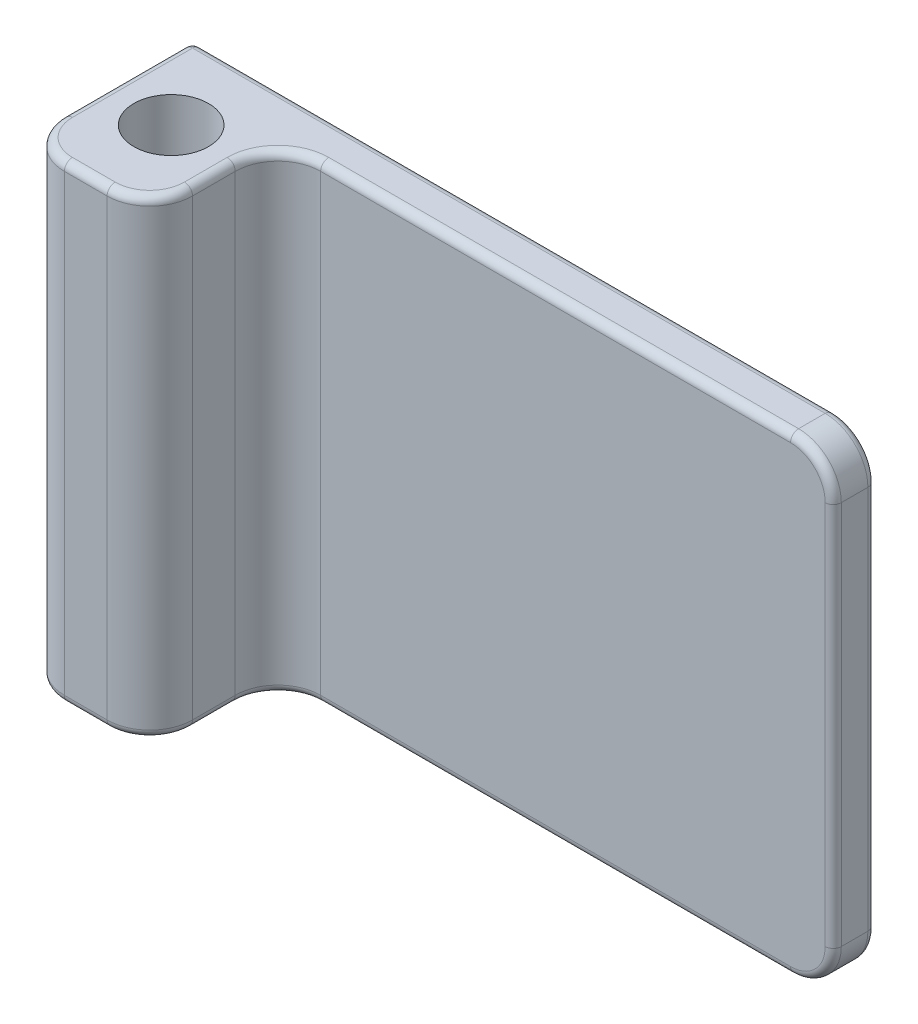
ISO-10303-21;
HEADER;
FILE_DESCRIPTION(('STEP AP214'),'2;1');
FILE_NAME('part.step','',(''),(''),'','','');
FILE_SCHEMA(('AUTOMOTIVE_DESIGN { 1 0 10303 214 1 1 1 1 }'));
ENDSEC;
DATA;
#1=APPLICATION_CONTEXT('core data for automotive mechanical design processes');
#2=APPLICATION_PROTOCOL_DEFINITION('international standard','automotive_design',2000,#1);
#3=PRODUCT_CONTEXT('',#1,'mechanical');
#4=PRODUCT('Part','Part','',(#3));
#5=PRODUCT_RELATED_PRODUCT_CATEGORY('part','',(#4));
#6=PRODUCT_DEFINITION_FORMATION('','',#4);
#7=PRODUCT_DEFINITION_CONTEXT('part definition',#1,'design');
#8=PRODUCT_DEFINITION('design','',#6,#7);
#9=PRODUCT_DEFINITION_SHAPE('','',#8);
#10=(LENGTH_UNIT() NAMED_UNIT(*) SI_UNIT(.MILLI.,.METRE.));
#11=(NAMED_UNIT(*) PLANE_ANGLE_UNIT() SI_UNIT($,.RADIAN.));
#12=(NAMED_UNIT(*) SI_UNIT($,.STERADIAN.) SOLID_ANGLE_UNIT());
#13=UNCERTAINTY_MEASURE_WITH_UNIT(LENGTH_MEASURE(1.E-05),#10,'distance_accuracy_value','');
#14=(GEOMETRIC_REPRESENTATION_CONTEXT(3) GLOBAL_UNCERTAINTY_ASSIGNED_CONTEXT((#13)) GLOBAL_UNIT_ASSIGNED_CONTEXT((#10,
#11,#12)) REPRESENTATION_CONTEXT('',''));
#15=CARTESIAN_POINT('',(0.,0.,0.));
#16=DIRECTION('',(0.,0.,1.));
#17=DIRECTION('',(1.,0.,0.));
#18=AXIS2_PLACEMENT_3D('',#15,#16,#17);
#19=CARTESIAN_POINT('',(101.6,69.85,50.8));
#20=DIRECTION('',(-1.,0.,0.));
#21=DIRECTION('',(0.,0.,1.));
#22=AXIS2_PLACEMENT_3D('',#19,#20,#21);
#23=PLANE('',#22);
#24=DIRECTION('',(0.,0.,-1.));
#25=VECTOR('',#24,1.);
#26=CARTESIAN_POINT('',(101.6,-57.15,50.8));
#27=LINE('',#26,#25);
#28=CARTESIAN_POINT('',(101.6,-57.15,10.3));
#29=VERTEX_POINT('',#28);
#30=CARTESIAN_POINT('',(101.6,-57.15,2.4));
#31=VERTEX_POINT('',#30);
#32=EDGE_CURVE('E215',#29,#31,#27,.T.);
#33=ORIENTED_EDGE('',*,*,#32,.T.);
#34=DIRECTION('',(0.,1.,0.));
#35=VECTOR('',#34,1.);
#36=CARTESIAN_POINT('',(101.6,69.85,2.4));
#37=LINE('',#36,#35);
#38=CARTESIAN_POINT('',(101.6,57.15,2.4));
#39=VERTEX_POINT('',#38);
#40=EDGE_CURVE('E307',#31,#39,#37,.T.);
#41=ORIENTED_EDGE('',*,*,#40,.T.);
#42=DIRECTION('',(0.,0.,-1.));
#43=VECTOR('',#42,1.);
#44=CARTESIAN_POINT('',(101.6,57.15,50.8));
#45=LINE('',#44,#43);
#46=CARTESIAN_POINT('',(101.6,57.15,10.3));
#47=VERTEX_POINT('',#46);
#48=EDGE_CURVE('E275',#39,#47,#45,.F.);
#49=ORIENTED_EDGE('',*,*,#48,.T.);
#50=DIRECTION('',(0.,-1.,0.));
#51=VECTOR('',#50,1.);
#52=CARTESIAN_POINT('',(101.6,69.85,10.3));
#53=LINE('',#52,#51);
#54=EDGE_CURVE('E305',#47,#29,#53,.T.);
#55=ORIENTED_EDGE('',*,*,#54,.T.);
#56=EDGE_LOOP('',(#33,#41,#49,#55));
#57=FACE_BOUND('',#56,.T.);
#58=ADVANCED_FACE('F39',(#57),#23,.F.);
#59=CARTESIAN_POINT('',(-101.6,69.85,50.8));
#60=DIRECTION('',(0.,-1.,0.));
#61=DIRECTION('',(0.,0.,-1.));
#62=AXIS2_PLACEMENT_3D('',#59,#60,#61);
#63=PLANE('',#62);
#64=CARTESIAN_POINT('',(-82.55,69.85,25.4));
#65=DIRECTION('',(0.,-1.,0.));
#66=DIRECTION('',(0.,0.,-1.));
#67=AXIS2_PLACEMENT_3D('',#64,#65,#66);
#68=CIRCLE('',#67,11.1125);
#69=CARTESIAN_POINT('',(-82.55,69.85,14.2875));
#70=VERTEX_POINT('',#69);
#71=EDGE_CURVE('E249',#70,#70,#68,.T.);
#72=ORIENTED_EDGE('',*,*,#71,.T.);
#73=EDGE_LOOP('',(#72));
#74=FACE_BOUND('',#73,.T.);
#75=DIRECTION('',(0.,0.,-1.));
#76=VECTOR('',#75,1.);
#77=CARTESIAN_POINT('',(88.9,69.85,50.8));
#78=LINE('',#77,#76);
#79=CARTESIAN_POINT('',(88.9,69.85,10.3));
#80=VERTEX_POINT('',#79);
#81=CARTESIAN_POINT('',(88.9,69.85,2.4));
#82=VERTEX_POINT('',#81);
#83=EDGE_CURVE('E197',#80,#82,#78,.T.);
#84=ORIENTED_EDGE('',*,*,#83,.T.);
#85=DIRECTION('',(-1.,0.,0.));
#86=VECTOR('',#85,1.);
#87=CARTESIAN_POINT('',(-101.6,69.85,2.4));
#88=LINE('',#87,#86);
#89=CARTESIAN_POINT('',(-99.2,69.85,2.4));
#90=VERTEX_POINT('',#89);
#91=EDGE_CURVE('E290',#82,#90,#88,.T.);
#92=ORIENTED_EDGE('',*,*,#91,.T.);
#93=DIRECTION('',(0.,0.,-1.));
#94=VECTOR('',#93,1.);
#95=CARTESIAN_POINT('',(-99.2,69.85,50.8));
#96=LINE('',#95,#94);
#97=CARTESIAN_POINT('',(-99.2,69.85,38.1));
#98=VERTEX_POINT('',#97);
#99=EDGE_CURVE('E288',#90,#98,#96,.F.);
#100=ORIENTED_EDGE('',*,*,#99,.T.);
#101=CARTESIAN_POINT('',(-88.9,69.85,38.1));
#102=DIRECTION('',(0.,-1.,0.));
#103=DIRECTION('',(0.,0.,-1.));
#104=AXIS2_PLACEMENT_3D('',#101,#102,#103);
#105=CIRCLE('',#104,10.3);
#106=CARTESIAN_POINT('',(-88.9,69.85,48.4));
#107=VERTEX_POINT('',#106);
#108=EDGE_CURVE('E286',#98,#107,#105,.F.);
#109=ORIENTED_EDGE('',*,*,#108,.T.);
#110=DIRECTION('',(-1.,0.,0.));
#111=VECTOR('',#110,1.);
#112=CARTESIAN_POINT('',(-76.2,69.85,48.4));
#113=LINE('',#112,#111);
#114=CARTESIAN_POINT('',(-76.2,69.85,48.4));
#115=VERTEX_POINT('',#114);
#116=EDGE_CURVE('E284',#107,#115,#113,.F.);
#117=ORIENTED_EDGE('',*,*,#116,.T.);
#118=CARTESIAN_POINT('',(-76.2,69.85,38.1));
#119=DIRECTION('',(0.,-1.,0.));
#120=DIRECTION('',(0.,0.,-1.));
#121=AXIS2_PLACEMENT_3D('',#118,#119,#120);
#122=CIRCLE('',#121,10.3);
#123=CARTESIAN_POINT('',(-65.9,69.85,38.1));
#124=VERTEX_POINT('',#123);
#125=EDGE_CURVE('E282',#115,#124,#122,.F.);
#126=ORIENTED_EDGE('',*,*,#125,.T.);
#127=DIRECTION('',(0.,0.,-1.));
#128=VECTOR('',#127,1.);
#129=CARTESIAN_POINT('',(-65.9,69.85,50.8));
#130=LINE('',#129,#128);
#131=CARTESIAN_POINT('',(-65.9,69.85,25.4));
#132=VERTEX_POINT('',#131);
#133=EDGE_CURVE('E280',#124,#132,#130,.T.);
#134=ORIENTED_EDGE('',*,*,#133,.T.);
#135=CARTESIAN_POINT('',(-50.8,69.85,25.4));
#136=DIRECTION('',(0.,-1.,0.));
#137=DIRECTION('',(0.,0.,-1.));
#138=AXIS2_PLACEMENT_3D('',#135,#136,#137);
#139=CIRCLE('',#138,15.1);
#140=CARTESIAN_POINT('',(-50.8,69.85,10.3));
#141=VERTEX_POINT('',#140);
#142=EDGE_CURVE('E200',#132,#141,#139,.T.);
#143=ORIENTED_EDGE('',*,*,#142,.T.);
#144=DIRECTION('',(1.,0.,0.));
#145=VECTOR('',#144,1.);
#146=CARTESIAN_POINT('',(-101.6,69.85,10.3));
#147=LINE('',#146,#145);
#148=EDGE_CURVE('E193',#141,#80,#147,.T.);
#149=ORIENTED_EDGE('',*,*,#148,.T.);
#150=EDGE_LOOP('',(#84,#92,#100,#109,#117,#126,#134,#143,#149));
#151=FACE_BOUND('',#150,.T.);
#152=ADVANCED_FACE('F195',(#74,#151),#63,.F.);
#153=CARTESIAN_POINT('',(-101.6,69.85,50.8));
#154=DIRECTION('',(1.,0.,0.));
#155=DIRECTION('',(0.,0.,-1.));
#156=AXIS2_PLACEMENT_3D('',#153,#154,#155);
#157=PLANE('',#156);
#158=DIRECTION('',(0.,-1.,0.));
#159=VECTOR('',#158,1.);
#160=CARTESIAN_POINT('',(-101.6,69.85,2.4));
#161=LINE('',#160,#159);
#162=CARTESIAN_POINT('',(-101.6,67.45,2.4));
#163=VERTEX_POINT('',#162);
#164=CARTESIAN_POINT('',(-101.6,-67.45,2.4));
#165=VERTEX_POINT('',#164);
#166=EDGE_CURVE('E329',#163,#165,#161,.T.);
#167=ORIENTED_EDGE('',*,*,#166,.T.);
#168=DIRECTION('',(0.,0.,-1.));
#169=VECTOR('',#168,1.);
#170=CARTESIAN_POINT('',(-101.6,-67.45,50.8));
#171=LINE('',#170,#169);
#172=CARTESIAN_POINT('',(-101.6,-67.45,38.1));
#173=VERTEX_POINT('',#172);
#174=EDGE_CURVE('E333',#165,#173,#171,.F.);
#175=ORIENTED_EDGE('',*,*,#174,.T.);
#176=DIRECTION('',(0.,-1.,0.));
#177=VECTOR('',#176,1.);
#178=CARTESIAN_POINT('',(-101.6,69.85,38.1));
#179=LINE('',#178,#177);
#180=CARTESIAN_POINT('',(-101.6,67.45,38.1));
#181=VERTEX_POINT('',#180);
#182=EDGE_CURVE('E262',#173,#181,#179,.F.);
#183=ORIENTED_EDGE('',*,*,#182,.T.);
#184=DIRECTION('',(0.,0.,-1.));
#185=VECTOR('',#184,1.);
#186=CARTESIAN_POINT('',(-101.6,67.45,50.8));
#187=LINE('',#186,#185);
#188=EDGE_CURVE('E331',#181,#163,#187,.T.);
#189=ORIENTED_EDGE('',*,*,#188,.T.);
#190=EDGE_LOOP('',(#167,#175,#183,#189));
#191=FACE_BOUND('',#190,.T.);
#192=ADVANCED_FACE('F464',(#191),#157,.F.);
#193=CARTESIAN_POINT('',(-101.6,-69.85,50.8));
#194=DIRECTION('',(0.,1.,0.));
#195=DIRECTION('',(0.,0.,1.));
#196=AXIS2_PLACEMENT_3D('',#193,#194,#195);
#197=PLANE('',#196);
#198=CARTESIAN_POINT('',(-82.55,-69.85,25.4));
#199=DIRECTION('',(0.,-1.,0.));
#200=DIRECTION('',(0.,0.,-1.));
#201=AXIS2_PLACEMENT_3D('',#198,#199,#200);
#202=CIRCLE('',#201,11.1125);
#203=CARTESIAN_POINT('',(-82.55,-69.85,14.2875));
#204=VERTEX_POINT('',#203);
#205=EDGE_CURVE('E244',#204,#204,#202,.T.);
#206=ORIENTED_EDGE('',*,*,#205,.F.);
#207=EDGE_LOOP('',(#206));
#208=FACE_BOUND('',#207,.T.);
#209=DIRECTION('',(0.,0.,-1.));
#210=VECTOR('',#209,1.);
#211=CARTESIAN_POINT('',(-99.2,-69.85,50.8));
#212=LINE('',#211,#210);
#213=CARTESIAN_POINT('',(-99.2,-69.85,38.1));
#214=VERTEX_POINT('',#213);
#215=CARTESIAN_POINT('',(-99.2,-69.85,2.4));
#216=VERTEX_POINT('',#215);
#217=EDGE_CURVE('E325',#214,#216,#212,.T.);
#218=ORIENTED_EDGE('',*,*,#217,.T.);
#219=DIRECTION('',(1.,0.,0.));
#220=VECTOR('',#219,1.);
#221=CARTESIAN_POINT('',(-101.6,-69.85,2.4));
#222=LINE('',#221,#220);
#223=CARTESIAN_POINT('',(88.9,-69.85,2.4));
#224=VERTEX_POINT('',#223);
#225=EDGE_CURVE('E327',#216,#224,#222,.T.);
#226=ORIENTED_EDGE('',*,*,#225,.T.);
#227=DIRECTION('',(0.,0.,-1.));
#228=VECTOR('',#227,1.);
#229=CARTESIAN_POINT('',(88.9,-69.85,50.8));
#230=LINE('',#229,#228);
#231=CARTESIAN_POINT('',(88.9,-69.85,10.3));
#232=VERTEX_POINT('',#231);
#233=EDGE_CURVE('E205',#224,#232,#230,.F.);
#234=ORIENTED_EDGE('',*,*,#233,.T.);
#235=DIRECTION('',(1.,0.,0.));
#236=VECTOR('',#235,1.);
#237=CARTESIAN_POINT('',(-101.6,-69.85,10.3));
#238=LINE('',#237,#236);
#239=CARTESIAN_POINT('',(-50.8,-69.85,10.3));
#240=VERTEX_POINT('',#239);
#241=EDGE_CURVE('E313',#232,#240,#238,.F.);
#242=ORIENTED_EDGE('',*,*,#241,.T.);
#243=CARTESIAN_POINT('',(-50.8,-69.85,25.4));
#244=DIRECTION('',(0.,1.,0.));
#245=DIRECTION('',(0.,0.,1.));
#246=AXIS2_PLACEMENT_3D('',#243,#244,#245);
#247=CIRCLE('',#246,15.1);
#248=CARTESIAN_POINT('',(-65.9,-69.85,25.4));
#249=VERTEX_POINT('',#248);
#250=EDGE_CURVE('E315',#240,#249,#247,.T.);
#251=ORIENTED_EDGE('',*,*,#250,.T.);
#252=DIRECTION('',(0.,0.,-1.));
#253=VECTOR('',#252,1.);
#254=CARTESIAN_POINT('',(-65.9,-69.85,50.8));
#255=LINE('',#254,#253);
#256=CARTESIAN_POINT('',(-65.9,-69.85,38.1));
#257=VERTEX_POINT('',#256);
#258=EDGE_CURVE('E317',#249,#257,#255,.F.);
#259=ORIENTED_EDGE('',*,*,#258,.T.);
#260=CARTESIAN_POINT('',(-76.2,-69.85,38.1));
#261=DIRECTION('',(0.,1.,0.));
#262=DIRECTION('',(0.,0.,1.));
#263=AXIS2_PLACEMENT_3D('',#260,#261,#262);
#264=CIRCLE('',#263,10.3);
#265=CARTESIAN_POINT('',(-76.2,-69.85,48.4));
#266=VERTEX_POINT('',#265);
#267=EDGE_CURVE('E319',#257,#266,#264,.F.);
#268=ORIENTED_EDGE('',*,*,#267,.T.);
#269=DIRECTION('',(1.,0.,0.));
#270=VECTOR('',#269,1.);
#271=CARTESIAN_POINT('',(-88.9,-69.85,48.4));
#272=LINE('',#271,#270);
#273=CARTESIAN_POINT('',(-88.9,-69.85,48.4));
#274=VERTEX_POINT('',#273);
#275=EDGE_CURVE('E321',#266,#274,#272,.F.);
#276=ORIENTED_EDGE('',*,*,#275,.T.);
#277=CARTESIAN_POINT('',(-88.9,-69.85,38.1));
#278=DIRECTION('',(0.,1.,0.));
#279=DIRECTION('',(0.,0.,1.));
#280=AXIS2_PLACEMENT_3D('',#277,#278,#279);
#281=CIRCLE('',#280,10.3);
#282=EDGE_CURVE('E323',#274,#214,#281,.F.);
#283=ORIENTED_EDGE('',*,*,#282,.T.);
#284=EDGE_LOOP('',(#218,#226,#234,#242,#251,#259,#268,#276,#283));
#285=FACE_BOUND('',#284,.T.);
#286=ADVANCED_FACE('F441',(#208,#285),#197,.F.);
#287=CARTESIAN_POINT('',(0.,0.,50.8));
#288=DIRECTION('',(0.,0.,1.));
#289=DIRECTION('',(1.,0.,0.));
#290=AXIS2_PLACEMENT_3D('',#287,#288,#289);
#291=PLANE('',#290);
#292=DIRECTION('',(0.,-1.,0.));
#293=VECTOR('',#292,1.);
#294=CARTESIAN_POINT('',(-88.9,-69.85,50.8));
#295=LINE('',#294,#293);
#296=CARTESIAN_POINT('',(-88.9,67.45,50.8));
#297=VERTEX_POINT('',#296);
#298=CARTESIAN_POINT('',(-88.9,-67.45,50.8));
#299=VERTEX_POINT('',#298);
#300=EDGE_CURVE('E259',#297,#299,#295,.T.);
#301=ORIENTED_EDGE('',*,*,#300,.T.);
#302=DIRECTION('',(1.,0.,0.));
#303=VECTOR('',#302,1.);
#304=CARTESIAN_POINT('',(-76.2,-67.45,50.8));
#305=LINE('',#304,#303);
#306=CARTESIAN_POINT('',(-76.2,-67.45,50.8));
#307=VERTEX_POINT('',#306);
#308=EDGE_CURVE('E342',#299,#307,#305,.T.);
#309=ORIENTED_EDGE('',*,*,#308,.T.);
#310=DIRECTION('',(0.,-1.,0.));
#311=VECTOR('',#310,1.);
#312=CARTESIAN_POINT('',(-76.2,69.85,50.8));
#313=LINE('',#312,#311);
#314=CARTESIAN_POINT('',(-76.2,67.45,50.8));
#315=VERTEX_POINT('',#314);
#316=EDGE_CURVE('E254',#307,#315,#313,.F.);
#317=ORIENTED_EDGE('',*,*,#316,.T.);
#318=DIRECTION('',(-1.,0.,0.));
#319=VECTOR('',#318,1.);
#320=CARTESIAN_POINT('',(-88.9,67.45,50.8));
#321=LINE('',#320,#319);
#322=EDGE_CURVE('E340',#315,#297,#321,.T.);
#323=ORIENTED_EDGE('',*,*,#322,.T.);
#324=EDGE_LOOP('',(#301,#309,#317,#323));
#325=FACE_BOUND('',#324,.T.);
#326=ADVANCED_FACE('F761',(#325),#291,.T.);
#327=CARTESIAN_POINT('',(0.,0.,0.));
#328=DIRECTION('',(0.,0.,1.));
#329=DIRECTION('',(1.,0.,0.));
#330=AXIS2_PLACEMENT_3D('',#327,#328,#329);
#331=PLANE('',#330);
#332=DIRECTION('',(0.,-1.,0.));
#333=VECTOR('',#332,1.);
#334=CARTESIAN_POINT('',(-99.2,0.,0.));
#335=LINE('',#334,#333);
#336=CARTESIAN_POINT('',(-99.2,-67.45,0.));
#337=VERTEX_POINT('',#336);
#338=CARTESIAN_POINT('',(-99.2,67.45,0.));
#339=VERTEX_POINT('',#338);
#340=EDGE_CURVE('E294',#337,#339,#335,.F.);
#341=ORIENTED_EDGE('',*,*,#340,.T.);
#342=DIRECTION('',(-1.,0.,0.));
#343=VECTOR('',#342,1.);
#344=CARTESIAN_POINT('',(0.,67.45,0.));
#345=LINE('',#344,#343);
#346=CARTESIAN_POINT('',(88.9,67.45,0.));
#347=VERTEX_POINT('',#346);
#348=EDGE_CURVE('E224',#339,#347,#345,.F.);
#349=ORIENTED_EDGE('',*,*,#348,.T.);
#350=CARTESIAN_POINT('',(88.9,57.15,0.));
#351=DIRECTION('',(0.,0.,1.));
#352=DIRECTION('',(1.,0.,0.));
#353=AXIS2_PLACEMENT_3D('',#350,#351,#352);
#354=CIRCLE('',#353,10.3);
#355=CARTESIAN_POINT('',(99.2,57.15,0.));
#356=VERTEX_POINT('',#355);
#357=EDGE_CURVE('E300',#347,#356,#354,.F.);
#358=ORIENTED_EDGE('',*,*,#357,.T.);
#359=DIRECTION('',(0.,1.,0.));
#360=VECTOR('',#359,1.);
#361=CARTESIAN_POINT('',(99.2,0.,0.));
#362=LINE('',#361,#360);
#363=CARTESIAN_POINT('',(99.2,-57.15,0.));
#364=VERTEX_POINT('',#363);
#365=EDGE_CURVE('E298',#356,#364,#362,.F.);
#366=ORIENTED_EDGE('',*,*,#365,.T.);
#367=CARTESIAN_POINT('',(88.9,-57.15,0.));
#368=DIRECTION('',(0.,0.,1.));
#369=DIRECTION('',(1.,0.,0.));
#370=AXIS2_PLACEMENT_3D('',#367,#368,#369);
#371=CIRCLE('',#370,10.3);
#372=CARTESIAN_POINT('',(88.9,-67.45,0.));
#373=VERTEX_POINT('',#372);
#374=EDGE_CURVE('E296',#364,#373,#371,.F.);
#375=ORIENTED_EDGE('',*,*,#374,.T.);
#376=DIRECTION('',(1.,0.,0.));
#377=VECTOR('',#376,1.);
#378=CARTESIAN_POINT('',(0.,-67.45,0.));
#379=LINE('',#378,#377);
#380=EDGE_CURVE('E292',#373,#337,#379,.F.);
#381=ORIENTED_EDGE('',*,*,#380,.T.);
#382=EDGE_LOOP('',(#341,#349,#358,#366,#375,#381));
#383=FACE_BOUND('',#382,.T.);
#384=ADVANCED_FACE('F753',(#383),#331,.F.);
#385=CARTESIAN_POINT('',(-63.5,69.85,50.8));
#386=DIRECTION('',(-1.,0.,0.));
#387=DIRECTION('',(0.,0.,1.));
#388=AXIS2_PLACEMENT_3D('',#385,#386,#387);
#389=PLANE('',#388);
#390=DIRECTION('',(0.,-1.,0.));
#391=VECTOR('',#390,1.);
#392=CARTESIAN_POINT('',(-63.5,-69.85,38.1));
#393=LINE('',#392,#391);
#394=CARTESIAN_POINT('',(-63.5,67.45,38.1));
#395=VERTEX_POINT('',#394);
#396=CARTESIAN_POINT('',(-63.5,-67.45,38.1));
#397=VERTEX_POINT('',#396);
#398=EDGE_CURVE('E268',#395,#397,#393,.T.);
#399=ORIENTED_EDGE('',*,*,#398,.T.);
#400=DIRECTION('',(0.,0.,-1.));
#401=VECTOR('',#400,1.);
#402=CARTESIAN_POINT('',(-63.5,-67.45,50.8));
#403=LINE('',#402,#401);
#404=CARTESIAN_POINT('',(-63.5,-67.45,25.4));
#405=VERTEX_POINT('',#404);
#406=EDGE_CURVE('E350',#397,#405,#403,.T.);
#407=ORIENTED_EDGE('',*,*,#406,.T.);
#408=DIRECTION('',(0.,-1.,0.));
#409=VECTOR('',#408,1.);
#410=CARTESIAN_POINT('',(-63.5,69.85,25.4));
#411=LINE('',#410,#409);
#412=CARTESIAN_POINT('',(-63.5,67.45,25.4));
#413=VERTEX_POINT('',#412);
#414=EDGE_CURVE('E265',#405,#413,#411,.F.);
#415=ORIENTED_EDGE('',*,*,#414,.T.);
#416=DIRECTION('',(0.,0.,-1.));
#417=VECTOR('',#416,1.);
#418=CARTESIAN_POINT('',(-63.5,67.45,50.8));
#419=LINE('',#418,#417);
#420=EDGE_CURVE('E348',#413,#395,#419,.F.);
#421=ORIENTED_EDGE('',*,*,#420,.T.);
#422=EDGE_LOOP('',(#399,#407,#415,#421));
#423=FACE_BOUND('',#422,.T.);
#424=ADVANCED_FACE('F426',(#423),#389,.F.);
#425=CARTESIAN_POINT('',(-63.5,69.85,12.7));
#426=DIRECTION('',(0.,0.,-1.));
#427=DIRECTION('',(-1.,0.,0.));
#428=AXIS2_PLACEMENT_3D('',#425,#426,#427);
#429=PLANE('',#428);
#430=CARTESIAN_POINT('',(88.9,57.15,12.7));
#431=DIRECTION('',(0.,0.,-1.));
#432=DIRECTION('',(-1.,0.,0.));
#433=AXIS2_PLACEMENT_3D('',#430,#431,#432);
#434=CIRCLE('',#433,10.3);
#435=CARTESIAN_POINT('',(99.2,57.15,12.7));
#436=VERTEX_POINT('',#435);
#437=CARTESIAN_POINT('',(88.9,67.45,12.7));
#438=VERTEX_POINT('',#437);
#439=EDGE_CURVE('E48',#436,#438,#434,.F.);
#440=ORIENTED_EDGE('',*,*,#439,.T.);
#441=DIRECTION('',(1.,0.,0.));
#442=VECTOR('',#441,1.);
#443=CARTESIAN_POINT('',(-63.5,67.45,12.7));
#444=LINE('',#443,#442);
#445=CARTESIAN_POINT('',(-50.8,67.45,12.7));
#446=VERTEX_POINT('',#445);
#447=EDGE_CURVE('E11',#438,#446,#444,.F.);
#448=ORIENTED_EDGE('',*,*,#447,.T.);
#449=DIRECTION('',(0.,-1.,0.));
#450=VECTOR('',#449,1.);
#451=CARTESIAN_POINT('',(-50.8,-69.85,12.7));
#452=LINE('',#451,#450);
#453=CARTESIAN_POINT('',(-50.8,-67.45,12.7));
#454=VERTEX_POINT('',#453);
#455=EDGE_CURVE('E216',#446,#454,#452,.T.);
#456=ORIENTED_EDGE('',*,*,#455,.T.);
#457=DIRECTION('',(1.,0.,0.));
#458=VECTOR('',#457,1.);
#459=CARTESIAN_POINT('',(-63.5,-67.45,12.7));
#460=LINE('',#459,#458);
#461=CARTESIAN_POINT('',(88.9,-67.45,12.7));
#462=VERTEX_POINT('',#461);
#463=EDGE_CURVE('E356',#454,#462,#460,.T.);
#464=ORIENTED_EDGE('',*,*,#463,.T.);
#465=CARTESIAN_POINT('',(88.9,-57.15,12.7));
#466=DIRECTION('',(0.,0.,-1.));
#467=DIRECTION('',(-1.,0.,0.));
#468=AXIS2_PLACEMENT_3D('',#465,#466,#467);
#469=CIRCLE('',#468,10.3);
#470=CARTESIAN_POINT('',(99.2,-57.15,12.7));
#471=VERTEX_POINT('',#470);
#472=EDGE_CURVE('E358',#462,#471,#469,.F.);
#473=ORIENTED_EDGE('',*,*,#472,.T.);
#474=DIRECTION('',(0.,-1.,0.));
#475=VECTOR('',#474,1.);
#476=CARTESIAN_POINT('',(99.2,69.85,12.7));
#477=LINE('',#476,#475);
#478=EDGE_CURVE('E59',#471,#436,#477,.F.);
#479=ORIENTED_EDGE('',*,*,#478,.T.);
#480=EDGE_LOOP('',(#440,#448,#456,#464,#473,#479));
#481=FACE_BOUND('',#480,.T.);
#482=ADVANCED_FACE('F447',(#481),#429,.F.);
#483=CARTESIAN_POINT('',(-82.55,69.85,25.4));
#484=DIRECTION('',(0.,-1.,0.));
#485=DIRECTION('',(0.,0.,-1.));
#486=AXIS2_PLACEMENT_3D('',#483,#484,#485);
#487=CYLINDRICAL_SURFACE('',#486,11.1125);
#488=ORIENTED_EDGE('',*,*,#71,.F.);
#489=EDGE_LOOP('',(#488));
#490=FACE_BOUND('',#489,.T.);
#491=ORIENTED_EDGE('',*,*,#205,.T.);
#492=EDGE_LOOP('',(#491));
#493=FACE_BOUND('',#492,.T.);
#494=ADVANCED_FACE('F473',(#490,#493),#487,.F.);
#495=CARTESIAN_POINT('',(-88.9,0.,38.1));
#496=DIRECTION('',(0.,1.,0.));
#497=DIRECTION('',(0.,0.,1.));
#498=AXIS2_PLACEMENT_3D('',#495,#496,#497);
#499=CYLINDRICAL_SURFACE('',#498,12.7);
#500=ORIENTED_EDGE('',*,*,#182,.F.);
#501=CARTESIAN_POINT('',(-88.9,-67.45,38.1));
#502=DIRECTION('',(0.,1.,0.));
#503=DIRECTION('',(0.,0.,1.));
#504=AXIS2_PLACEMENT_3D('',#501,#502,#503);
#505=CIRCLE('',#504,12.7);
#506=EDGE_CURVE('E338',#173,#299,#505,.T.);
#507=ORIENTED_EDGE('',*,*,#506,.T.);
#508=ORIENTED_EDGE('',*,*,#300,.F.);
#509=CARTESIAN_POINT('',(-88.9,67.45,38.1));
#510=DIRECTION('',(0.,-1.,0.));
#511=DIRECTION('',(0.,0.,-1.));
#512=AXIS2_PLACEMENT_3D('',#509,#510,#511);
#513=CIRCLE('',#512,12.7);
#514=EDGE_CURVE('E336',#297,#181,#513,.T.);
#515=ORIENTED_EDGE('',*,*,#514,.T.);
#516=EDGE_LOOP('',(#500,#507,#508,#515));
#517=FACE_BOUND('',#516,.T.);
#518=ADVANCED_FACE('F469',(#517),#499,.T.);
#519=CARTESIAN_POINT('',(-76.2,69.85,38.1));
#520=DIRECTION('',(0.,1.,0.));
#521=DIRECTION('',(0.,0.,1.));
#522=AXIS2_PLACEMENT_3D('',#519,#520,#521);
#523=CYLINDRICAL_SURFACE('',#522,12.7);
#524=ORIENTED_EDGE('',*,*,#316,.F.);
#525=CARTESIAN_POINT('',(-76.2,-67.45,38.1));
#526=DIRECTION('',(0.,1.,0.));
#527=DIRECTION('',(0.,0.,1.));
#528=AXIS2_PLACEMENT_3D('',#525,#526,#527);
#529=CIRCLE('',#528,12.7);
#530=EDGE_CURVE('E346',#307,#397,#529,.T.);
#531=ORIENTED_EDGE('',*,*,#530,.T.);
#532=ORIENTED_EDGE('',*,*,#398,.F.);
#533=CARTESIAN_POINT('',(-76.2,67.45,38.1));
#534=DIRECTION('',(0.,-1.,0.));
#535=DIRECTION('',(0.,0.,-1.));
#536=AXIS2_PLACEMENT_3D('',#533,#534,#535);
#537=CIRCLE('',#536,12.7);
#538=EDGE_CURVE('E344',#395,#315,#537,.T.);
#539=ORIENTED_EDGE('',*,*,#538,.T.);
#540=EDGE_LOOP('',(#524,#531,#532,#539));
#541=FACE_BOUND('',#540,.T.);
#542=ADVANCED_FACE('F472',(#541),#523,.T.);
#543=CARTESIAN_POINT('',(-50.8,69.85,25.4));
#544=DIRECTION('',(0.,1.,0.));
#545=DIRECTION('',(0.,0.,1.));
#546=AXIS2_PLACEMENT_3D('',#543,#544,#545);
#547=CYLINDRICAL_SURFACE('',#546,12.7);
#548=ORIENTED_EDGE('',*,*,#414,.F.);
#549=CARTESIAN_POINT('',(-50.8,-67.45,25.4));
#550=DIRECTION('',(0.,1.,0.));
#551=DIRECTION('',(0.,0.,1.));
#552=AXIS2_PLACEMENT_3D('',#549,#550,#551);
#553=CIRCLE('',#552,12.7);
#554=EDGE_CURVE('E354',#405,#454,#553,.F.);
#555=ORIENTED_EDGE('',*,*,#554,.T.);
#556=ORIENTED_EDGE('',*,*,#455,.F.);
#557=CARTESIAN_POINT('',(-50.8,67.45,25.4));
#558=DIRECTION('',(0.,-1.,0.));
#559=DIRECTION('',(0.,0.,-1.));
#560=AXIS2_PLACEMENT_3D('',#557,#558,#559);
#561=CIRCLE('',#560,12.7);
#562=EDGE_CURVE('E352',#446,#413,#561,.F.);
#563=ORIENTED_EDGE('',*,*,#562,.T.);
#564=EDGE_LOOP('',(#548,#555,#556,#563));
#565=FACE_BOUND('',#564,.T.);
#566=ADVANCED_FACE('F423',(#565),#547,.F.);
#567=CARTESIAN_POINT('',(88.9,57.15,50.8));
#568=DIRECTION('',(0.,0.,-1.));
#569=DIRECTION('',(-1.,0.,0.));
#570=AXIS2_PLACEMENT_3D('',#567,#568,#569);
#571=CYLINDRICAL_SURFACE('',#570,12.7);
#572=ORIENTED_EDGE('',*,*,#48,.F.);
#573=CARTESIAN_POINT('',(88.9,57.15,2.4));
#574=DIRECTION('',(0.,0.,1.));
#575=DIRECTION('',(1.,0.,0.));
#576=AXIS2_PLACEMENT_3D('',#573,#574,#575);
#577=CIRCLE('',#576,12.7);
#578=EDGE_CURVE('E214',#39,#82,#577,.T.);
#579=ORIENTED_EDGE('',*,*,#578,.T.);
#580=ORIENTED_EDGE('',*,*,#83,.F.);
#581=CARTESIAN_POINT('',(88.9,57.15,10.3));
#582=DIRECTION('',(0.,0.,-1.));
#583=DIRECTION('',(-1.,0.,0.));
#584=AXIS2_PLACEMENT_3D('',#581,#582,#583);
#585=CIRCLE('',#584,12.7);
#586=EDGE_CURVE('E211',#80,#47,#585,.T.);
#587=ORIENTED_EDGE('',*,*,#586,.T.);
#588=EDGE_LOOP('',(#572,#579,#580,#587));
#589=FACE_BOUND('',#588,.T.);
#590=ADVANCED_FACE('F210',(#589),#571,.T.);
#591=CARTESIAN_POINT('',(88.9,-57.15,50.8));
#592=DIRECTION('',(0.,0.,-1.));
#593=DIRECTION('',(-1.,0.,0.));
#594=AXIS2_PLACEMENT_3D('',#591,#592,#593);
#595=CYLINDRICAL_SURFACE('',#594,12.7);
#596=ORIENTED_EDGE('',*,*,#233,.F.);
#597=CARTESIAN_POINT('',(88.9,-57.15,2.4));
#598=DIRECTION('',(0.,0.,1.));
#599=DIRECTION('',(1.,0.,0.));
#600=AXIS2_PLACEMENT_3D('',#597,#598,#599);
#601=CIRCLE('',#600,12.7);
#602=EDGE_CURVE('E311',#224,#31,#601,.T.);
#603=ORIENTED_EDGE('',*,*,#602,.T.);
#604=ORIENTED_EDGE('',*,*,#32,.F.);
#605=CARTESIAN_POINT('',(88.9,-57.15,10.3));
#606=DIRECTION('',(0.,0.,-1.));
#607=DIRECTION('',(-1.,0.,0.));
#608=AXIS2_PLACEMENT_3D('',#605,#606,#607);
#609=CIRCLE('',#608,12.7);
#610=EDGE_CURVE('E309',#29,#232,#609,.T.);
#611=ORIENTED_EDGE('',*,*,#610,.T.);
#612=EDGE_LOOP('',(#596,#603,#604,#611));
#613=FACE_BOUND('',#612,.T.);
#614=ADVANCED_FACE('F482',(#613),#595,.T.);
#615=CARTESIAN_POINT('',(88.9,-57.15,10.3));
#616=DIRECTION('',(0.,0.,-1.));
#617=DIRECTION('',(-1.,0.,0.));
#618=AXIS2_PLACEMENT_3D('',#615,#616,#617);
#619=TOROIDAL_SURFACE('',#618,10.3,2.4);
#620=CARTESIAN_POINT('',(88.9,-67.45,10.3));
#621=DIRECTION('',(-1.,0.,0.));
#622=DIRECTION('',(0.,0.,1.));
#623=AXIS2_PLACEMENT_3D('',#620,#621,#622);
#624=CIRCLE('',#623,2.4);
#625=EDGE_CURVE('E237',#232,#462,#624,.T.);
#626=ORIENTED_EDGE('',*,*,#625,.F.);
#627=ORIENTED_EDGE('',*,*,#610,.F.);
#628=CARTESIAN_POINT('',(99.2,-57.15,10.3));
#629=DIRECTION('',(0.,1.,0.));
#630=DIRECTION('',(0.,0.,1.));
#631=AXIS2_PLACEMENT_3D('',#628,#629,#630);
#632=CIRCLE('',#631,2.4);
#633=EDGE_CURVE('E43',#471,#29,#632,.T.);
#634=ORIENTED_EDGE('',*,*,#633,.F.);
#635=ORIENTED_EDGE('',*,*,#472,.F.);
#636=EDGE_LOOP('',(#626,#627,#634,#635));
#637=FACE_BOUND('',#636,.T.);
#638=ADVANCED_FACE('F41',(#637),#619,.T.);
#639=CARTESIAN_POINT('',(99.2,69.85,10.3));
#640=DIRECTION('',(0.,-1.,0.));
#641=DIRECTION('',(0.,0.,-1.));
#642=AXIS2_PLACEMENT_3D('',#639,#640,#641);
#643=CYLINDRICAL_SURFACE('',#642,2.4);
#644=ORIENTED_EDGE('',*,*,#633,.T.);
#645=ORIENTED_EDGE('',*,*,#54,.F.);
#646=CARTESIAN_POINT('',(99.2,57.15,10.3));
#647=DIRECTION('',(0.,1.,0.));
#648=DIRECTION('',(0.,0.,1.));
#649=AXIS2_PLACEMENT_3D('',#646,#647,#648);
#650=CIRCLE('',#649,2.4);
#651=EDGE_CURVE('E223',#436,#47,#650,.T.);
#652=ORIENTED_EDGE('',*,*,#651,.F.);
#653=ORIENTED_EDGE('',*,*,#478,.F.);
#654=EDGE_LOOP('',(#644,#645,#652,#653));
#655=FACE_BOUND('',#654,.T.);
#656=ADVANCED_FACE('F451',(#655),#643,.T.);
#657=CARTESIAN_POINT('',(-63.5,-67.45,10.3));
#658=DIRECTION('',(1.,0.,0.));
#659=DIRECTION('',(0.,0.,-1.));
#660=AXIS2_PLACEMENT_3D('',#657,#658,#659);
#661=CYLINDRICAL_SURFACE('',#660,2.4);
#662=ORIENTED_EDGE('',*,*,#625,.T.);
#663=ORIENTED_EDGE('',*,*,#463,.F.);
#664=CARTESIAN_POINT('',(-50.8,-67.45,10.3));
#665=DIRECTION('',(-1.,0.,0.));
#666=DIRECTION('',(0.,0.,1.));
#667=AXIS2_PLACEMENT_3D('',#664,#665,#666);
#668=CIRCLE('',#667,2.4);
#669=EDGE_CURVE('E227',#240,#454,#668,.T.);
#670=ORIENTED_EDGE('',*,*,#669,.F.);
#671=ORIENTED_EDGE('',*,*,#241,.F.);
#672=EDGE_LOOP('',(#662,#663,#670,#671));
#673=FACE_BOUND('',#672,.T.);
#674=ADVANCED_FACE('F449',(#673),#661,.T.);
#675=CARTESIAN_POINT('',(88.9,57.15,10.3));
#676=DIRECTION('',(0.,0.,-1.));
#677=DIRECTION('',(-1.,0.,0.));
#678=AXIS2_PLACEMENT_3D('',#675,#676,#677);
#679=TOROIDAL_SURFACE('',#678,10.3,2.4);
#680=ORIENTED_EDGE('',*,*,#651,.T.);
#681=ORIENTED_EDGE('',*,*,#586,.F.);
#682=CARTESIAN_POINT('',(88.9,67.45,10.3));
#683=DIRECTION('',(-1.,0.,0.));
#684=DIRECTION('',(0.,0.,1.));
#685=AXIS2_PLACEMENT_3D('',#682,#683,#684);
#686=CIRCLE('',#685,2.4);
#687=EDGE_CURVE('E221',#438,#80,#686,.T.);
#688=ORIENTED_EDGE('',*,*,#687,.F.);
#689=ORIENTED_EDGE('',*,*,#439,.F.);
#690=EDGE_LOOP('',(#680,#681,#688,#689));
#691=FACE_BOUND('',#690,.T.);
#692=ADVANCED_FACE('F220',(#691),#679,.T.);
#693=CARTESIAN_POINT('',(-50.8,-67.45,25.4));
#694=DIRECTION('',(0.,1.,0.));
#695=DIRECTION('',(0.,0.,1.));
#696=AXIS2_PLACEMENT_3D('',#693,#694,#695);
#697=TOROIDAL_SURFACE('',#696,15.1,2.4);
#698=ORIENTED_EDGE('',*,*,#669,.T.);
#699=ORIENTED_EDGE('',*,*,#554,.F.);
#700=CARTESIAN_POINT('',(-65.9,-67.45,25.4));
#701=DIRECTION('',(0.,0.,1.));
#702=DIRECTION('',(1.,0.,0.));
#703=AXIS2_PLACEMENT_3D('',#700,#701,#702);
#704=CIRCLE('',#703,2.4);
#705=EDGE_CURVE('E228',#249,#405,#704,.T.);
#706=ORIENTED_EDGE('',*,*,#705,.F.);
#707=ORIENTED_EDGE('',*,*,#250,.F.);
#708=EDGE_LOOP('',(#698,#699,#706,#707));
#709=FACE_BOUND('',#708,.T.);
#710=ADVANCED_FACE('F446',(#709),#697,.T.);
#711=CARTESIAN_POINT('',(-101.6,67.45,10.3));
#712=DIRECTION('',(1.,0.,0.));
#713=DIRECTION('',(0.,0.,-1.));
#714=AXIS2_PLACEMENT_3D('',#711,#712,#713);
#715=CYLINDRICAL_SURFACE('',#714,2.4);
#716=ORIENTED_EDGE('',*,*,#687,.T.);
#717=ORIENTED_EDGE('',*,*,#148,.F.);
#718=CARTESIAN_POINT('',(-50.8,67.45,10.3));
#719=DIRECTION('',(-1.,0.,0.));
#720=DIRECTION('',(0.,0.,1.));
#721=AXIS2_PLACEMENT_3D('',#718,#719,#720);
#722=CIRCLE('',#721,2.4);
#723=EDGE_CURVE('E233',#446,#141,#722,.T.);
#724=ORIENTED_EDGE('',*,*,#723,.F.);
#725=ORIENTED_EDGE('',*,*,#447,.F.);
#726=EDGE_LOOP('',(#716,#717,#724,#725));
#727=FACE_BOUND('',#726,.T.);
#728=ADVANCED_FACE('F226',(#727),#715,.T.);
#729=CARTESIAN_POINT('',(-65.9,-67.45,50.8));
#730=DIRECTION('',(0.,0.,-1.));
#731=DIRECTION('',(-1.,0.,0.));
#732=AXIS2_PLACEMENT_3D('',#729,#730,#731);
#733=CYLINDRICAL_SURFACE('',#732,2.4);
#734=ORIENTED_EDGE('',*,*,#705,.T.);
#735=ORIENTED_EDGE('',*,*,#406,.F.);
#736=CARTESIAN_POINT('',(-65.9,-67.45,38.1));
#737=DIRECTION('',(0.,0.,1.));
#738=DIRECTION('',(1.,0.,0.));
#739=AXIS2_PLACEMENT_3D('',#736,#737,#738);
#740=CIRCLE('',#739,2.4);
#741=EDGE_CURVE('E413',#257,#397,#740,.T.);
#742=ORIENTED_EDGE('',*,*,#741,.F.);
#743=ORIENTED_EDGE('',*,*,#258,.F.);
#744=EDGE_LOOP('',(#734,#735,#742,#743));
#745=FACE_BOUND('',#744,.T.);
#746=ADVANCED_FACE('F431',(#745),#733,.T.);
#747=CARTESIAN_POINT('',(-50.8,67.45,25.4));
#748=DIRECTION('',(0.,-1.,0.));
#749=DIRECTION('',(0.,0.,-1.));
#750=AXIS2_PLACEMENT_3D('',#747,#748,#749);
#751=TOROIDAL_SURFACE('',#750,15.1,2.4);
#752=ORIENTED_EDGE('',*,*,#723,.T.);
#753=ORIENTED_EDGE('',*,*,#142,.F.);
#754=CARTESIAN_POINT('',(-65.9,67.45,25.4));
#755=DIRECTION('',(0.,0.,1.));
#756=DIRECTION('',(1.,0.,0.));
#757=AXIS2_PLACEMENT_3D('',#754,#755,#756);
#758=CIRCLE('',#757,2.4);
#759=EDGE_CURVE('E410',#413,#132,#758,.T.);
#760=ORIENTED_EDGE('',*,*,#759,.F.);
#761=ORIENTED_EDGE('',*,*,#562,.F.);
#762=EDGE_LOOP('',(#752,#753,#760,#761));
#763=FACE_BOUND('',#762,.T.);
#764=ADVANCED_FACE('F417',(#763),#751,.T.);
#765=CARTESIAN_POINT('',(-76.2,-67.45,38.1));
#766=DIRECTION('',(0.,1.,0.));
#767=DIRECTION('',(0.,0.,1.));
#768=AXIS2_PLACEMENT_3D('',#765,#766,#767);
#769=TOROIDAL_SURFACE('',#768,10.3,2.4);
#770=ORIENTED_EDGE('',*,*,#741,.T.);
#771=ORIENTED_EDGE('',*,*,#530,.F.);
#772=CARTESIAN_POINT('',(-76.2,-67.45,48.4));
#773=DIRECTION('',(-1.,0.,0.));
#774=DIRECTION('',(0.,0.,1.));
#775=AXIS2_PLACEMENT_3D('',#772,#773,#774);
#776=CIRCLE('',#775,2.4);
#777=EDGE_CURVE('E407',#266,#307,#776,.T.);
#778=ORIENTED_EDGE('',*,*,#777,.F.);
#779=ORIENTED_EDGE('',*,*,#267,.F.);
#780=EDGE_LOOP('',(#770,#771,#778,#779));
#781=FACE_BOUND('',#780,.T.);
#782=ADVANCED_FACE('F437',(#781),#769,.T.);
#783=CARTESIAN_POINT('',(-65.9,67.45,50.8));
#784=DIRECTION('',(0.,0.,-1.));
#785=DIRECTION('',(-1.,0.,0.));
#786=AXIS2_PLACEMENT_3D('',#783,#784,#785);
#787=CYLINDRICAL_SURFACE('',#786,2.4);
#788=ORIENTED_EDGE('',*,*,#759,.T.);
#789=ORIENTED_EDGE('',*,*,#133,.F.);
#790=CARTESIAN_POINT('',(-65.9,67.45,38.1));
#791=DIRECTION('',(0.,0.,1.));
#792=DIRECTION('',(1.,0.,0.));
#793=AXIS2_PLACEMENT_3D('',#790,#791,#792);
#794=CIRCLE('',#793,2.4);
#795=EDGE_CURVE('E404',#395,#124,#794,.T.);
#796=ORIENTED_EDGE('',*,*,#795,.F.);
#797=ORIENTED_EDGE('',*,*,#420,.F.);
#798=EDGE_LOOP('',(#788,#789,#796,#797));
#799=FACE_BOUND('',#798,.T.);
#800=ADVANCED_FACE('F545',(#799),#787,.T.);
#801=CARTESIAN_POINT('',(0.,-67.45,48.4));
#802=DIRECTION('',(-1.,0.,0.));
#803=DIRECTION('',(0.,0.,1.));
#804=AXIS2_PLACEMENT_3D('',#801,#802,#803);
#805=CYLINDRICAL_SURFACE('',#804,2.4);
#806=ORIENTED_EDGE('',*,*,#777,.T.);
#807=ORIENTED_EDGE('',*,*,#308,.F.);
#808=CARTESIAN_POINT('',(-88.9,-67.45,48.4));
#809=DIRECTION('',(-1.,0.,0.));
#810=DIRECTION('',(0.,0.,1.));
#811=AXIS2_PLACEMENT_3D('',#808,#809,#810);
#812=CIRCLE('',#811,2.4);
#813=EDGE_CURVE('E401',#274,#299,#812,.T.);
#814=ORIENTED_EDGE('',*,*,#813,.F.);
#815=ORIENTED_EDGE('',*,*,#275,.F.);
#816=EDGE_LOOP('',(#806,#807,#814,#815));
#817=FACE_BOUND('',#816,.T.);
#818=ADVANCED_FACE('F541',(#817),#805,.T.);
#819=CARTESIAN_POINT('',(-76.2,67.45,38.1));
#820=DIRECTION('',(0.,-1.,0.));
#821=DIRECTION('',(0.,0.,-1.));
#822=AXIS2_PLACEMENT_3D('',#819,#820,#821);
#823=TOROIDAL_SURFACE('',#822,10.3,2.4);
#824=ORIENTED_EDGE('',*,*,#795,.T.);
#825=ORIENTED_EDGE('',*,*,#125,.F.);
#826=CARTESIAN_POINT('',(-76.2,67.45,48.4));
#827=DIRECTION('',(-1.,0.,0.));
#828=DIRECTION('',(0.,0.,1.));
#829=AXIS2_PLACEMENT_3D('',#826,#827,#828);
#830=CIRCLE('',#829,2.4);
#831=EDGE_CURVE('E398',#315,#115,#830,.T.);
#832=ORIENTED_EDGE('',*,*,#831,.F.);
#833=ORIENTED_EDGE('',*,*,#538,.F.);
#834=EDGE_LOOP('',(#824,#825,#832,#833));
#835=FACE_BOUND('',#834,.T.);
#836=ADVANCED_FACE('F537',(#835),#823,.T.);
#837=CARTESIAN_POINT('',(-88.9,-67.45,38.1));
#838=DIRECTION('',(0.,1.,0.));
#839=DIRECTION('',(0.,0.,1.));
#840=AXIS2_PLACEMENT_3D('',#837,#838,#839);
#841=TOROIDAL_SURFACE('',#840,10.3,2.4);
#842=ORIENTED_EDGE('',*,*,#813,.T.);
#843=ORIENTED_EDGE('',*,*,#506,.F.);
#844=CARTESIAN_POINT('',(-99.2,-67.45,38.1));
#845=DIRECTION('',(0.,0.,-1.));
#846=DIRECTION('',(-1.,0.,0.));
#847=AXIS2_PLACEMENT_3D('',#844,#845,#846);
#848=CIRCLE('',#847,2.4);
#849=EDGE_CURVE('E396',#214,#173,#848,.T.);
#850=ORIENTED_EDGE('',*,*,#849,.F.);
#851=ORIENTED_EDGE('',*,*,#282,.F.);
#852=EDGE_LOOP('',(#842,#843,#850,#851));
#853=FACE_BOUND('',#852,.T.);
#854=ADVANCED_FACE('F533',(#853),#841,.T.);
#855=CARTESIAN_POINT('',(0.,67.45,48.4));
#856=DIRECTION('',(1.,0.,0.));
#857=DIRECTION('',(0.,0.,-1.));
#858=AXIS2_PLACEMENT_3D('',#855,#856,#857);
#859=CYLINDRICAL_SURFACE('',#858,2.4);
#860=ORIENTED_EDGE('',*,*,#831,.T.);
#861=ORIENTED_EDGE('',*,*,#116,.F.);
#862=CARTESIAN_POINT('',(-88.9,67.45,48.4));
#863=DIRECTION('',(-1.,0.,0.));
#864=DIRECTION('',(0.,0.,1.));
#865=AXIS2_PLACEMENT_3D('',#862,#863,#864);
#866=CIRCLE('',#865,2.4);
#867=EDGE_CURVE('E390',#297,#107,#866,.T.);
#868=ORIENTED_EDGE('',*,*,#867,.F.);
#869=ORIENTED_EDGE('',*,*,#322,.F.);
#870=EDGE_LOOP('',(#860,#861,#868,#869));
#871=FACE_BOUND('',#870,.T.);
#872=ADVANCED_FACE('F529',(#871),#859,.T.);
#873=CARTESIAN_POINT('',(-99.2,-67.45,50.8));
#874=DIRECTION('',(0.,0.,-1.));
#875=DIRECTION('',(-1.,0.,0.));
#876=AXIS2_PLACEMENT_3D('',#873,#874,#875);
#877=CYLINDRICAL_SURFACE('',#876,2.4);
#878=ORIENTED_EDGE('',*,*,#849,.T.);
#879=ORIENTED_EDGE('',*,*,#174,.F.);
#880=CARTESIAN_POINT('',(-99.2,-67.45,2.4));
#881=DIRECTION('',(0.,0.,-1.));
#882=DIRECTION('',(-1.,0.,0.));
#883=AXIS2_PLACEMENT_3D('',#880,#881,#882);
#884=CIRCLE('',#883,2.4);
#885=EDGE_CURVE('E387',#216,#165,#884,.T.);
#886=ORIENTED_EDGE('',*,*,#885,.F.);
#887=ORIENTED_EDGE('',*,*,#217,.F.);
#888=EDGE_LOOP('',(#878,#879,#886,#887));
#889=FACE_BOUND('',#888,.T.);
#890=ADVANCED_FACE('F525',(#889),#877,.T.);
#891=CARTESIAN_POINT('',(-101.6,-67.45,2.4));
#892=DIRECTION('',(1.,0.,0.));
#893=DIRECTION('',(0.,0.,-1.));
#894=AXIS2_PLACEMENT_3D('',#891,#892,#893);
#895=CYLINDRICAL_SURFACE('',#894,2.4);
#896=CARTESIAN_POINT('',(-99.2,-67.45,2.4));
#897=DIRECTION('',(-1.,0.,0.));
#898=DIRECTION('',(0.,0.,1.));
#899=AXIS2_PLACEMENT_3D('',#896,#897,#898);
#900=CIRCLE('',#899,2.4);
#901=EDGE_CURVE('E384',#337,#216,#900,.T.);
#902=ORIENTED_EDGE('',*,*,#901,.F.);
#903=ORIENTED_EDGE('',*,*,#380,.F.);
#904=CARTESIAN_POINT('',(88.9,-67.45,2.4));
#905=DIRECTION('',(1.,0.,0.));
#906=DIRECTION('',(0.,0.,-1.));
#907=AXIS2_PLACEMENT_3D('',#904,#905,#906);
#908=CIRCLE('',#907,2.4);
#909=EDGE_CURVE('E393',#224,#373,#908,.T.);
#910=ORIENTED_EDGE('',*,*,#909,.F.);
#911=ORIENTED_EDGE('',*,*,#225,.F.);
#912=EDGE_LOOP('',(#902,#903,#910,#911));
#913=FACE_BOUND('',#912,.T.);
#914=ADVANCED_FACE('F521',(#913),#895,.T.);
#915=CARTESIAN_POINT('',(88.9,-57.15,2.4));
#916=DIRECTION('',(0.,0.,1.));
#917=DIRECTION('',(1.,0.,0.));
#918=AXIS2_PLACEMENT_3D('',#915,#916,#917);
#919=TOROIDAL_SURFACE('',#918,10.3,2.4);
#920=ORIENTED_EDGE('',*,*,#909,.T.);
#921=ORIENTED_EDGE('',*,*,#374,.F.);
#922=CARTESIAN_POINT('',(99.2,-57.15,2.4));
#923=DIRECTION('',(0.,1.,0.));
#924=DIRECTION('',(0.,0.,1.));
#925=AXIS2_PLACEMENT_3D('',#922,#923,#924);
#926=CIRCLE('',#925,2.4);
#927=EDGE_CURVE('E381',#31,#364,#926,.T.);
#928=ORIENTED_EDGE('',*,*,#927,.F.);
#929=ORIENTED_EDGE('',*,*,#602,.F.);
#930=EDGE_LOOP('',(#920,#921,#928,#929));
#931=FACE_BOUND('',#930,.T.);
#932=ADVANCED_FACE('F517',(#931),#919,.T.);
#933=CARTESIAN_POINT('',(-88.9,67.45,38.1));
#934=DIRECTION('',(0.,-1.,0.));
#935=DIRECTION('',(0.,0.,-1.));
#936=AXIS2_PLACEMENT_3D('',#933,#934,#935);
#937=TOROIDAL_SURFACE('',#936,10.3,2.4);
#938=ORIENTED_EDGE('',*,*,#867,.T.);
#939=ORIENTED_EDGE('',*,*,#108,.F.);
#940=CARTESIAN_POINT('',(-99.2,67.45,38.1));
#941=DIRECTION('',(0.,0.,-1.));
#942=DIRECTION('',(-1.,0.,0.));
#943=AXIS2_PLACEMENT_3D('',#940,#941,#942);
#944=CIRCLE('',#943,2.4);
#945=EDGE_CURVE('E378',#181,#98,#944,.T.);
#946=ORIENTED_EDGE('',*,*,#945,.F.);
#947=ORIENTED_EDGE('',*,*,#514,.F.);
#948=EDGE_LOOP('',(#938,#939,#946,#947));
#949=FACE_BOUND('',#948,.T.);
#950=ADVANCED_FACE('F513',(#949),#937,.T.);
#951=CARTESIAN_POINT('',(-99.2,-67.45,2.4));
#952=DIRECTION('',(0.,0.,1.));
#953=DIRECTION('',(1.,0.,0.));
#954=AXIS2_PLACEMENT_3D('',#951,#952,#953);
#955=SPHERICAL_SURFACE('',#954,2.4);
#956=ORIENTED_EDGE('',*,*,#901,.T.);
#957=ORIENTED_EDGE('',*,*,#885,.T.);
#958=CARTESIAN_POINT('',(-99.2,-67.45,2.4));
#959=DIRECTION('',(0.,-1.,0.));
#960=DIRECTION('',(0.,0.,-1.));
#961=AXIS2_PLACEMENT_3D('',#958,#959,#960);
#962=CIRCLE('',#961,2.4);
#963=EDGE_CURVE('E375',#337,#165,#962,.F.);
#964=ORIENTED_EDGE('',*,*,#963,.F.);
#965=EDGE_LOOP('',(#956,#957,#964));
#966=FACE_BOUND('',#965,.T.);
#967=ADVANCED_FACE('F509',(#966),#955,.T.);
#968=CARTESIAN_POINT('',(99.2,69.85,2.4));
#969=DIRECTION('',(0.,1.,0.));
#970=DIRECTION('',(0.,0.,1.));
#971=AXIS2_PLACEMENT_3D('',#968,#969,#970);
#972=CYLINDRICAL_SURFACE('',#971,2.4);
#973=ORIENTED_EDGE('',*,*,#927,.T.);
#974=ORIENTED_EDGE('',*,*,#365,.F.);
#975=CARTESIAN_POINT('',(99.2,57.15,2.4));
#976=DIRECTION('',(0.,1.,0.));
#977=DIRECTION('',(0.,0.,1.));
#978=AXIS2_PLACEMENT_3D('',#975,#976,#977);
#979=CIRCLE('',#978,2.4);
#980=EDGE_CURVE('E372',#39,#356,#979,.T.);
#981=ORIENTED_EDGE('',*,*,#980,.F.);
#982=ORIENTED_EDGE('',*,*,#40,.F.);
#983=EDGE_LOOP('',(#973,#974,#981,#982));
#984=FACE_BOUND('',#983,.T.);
#985=ADVANCED_FACE('F505',(#984),#972,.T.);
#986=CARTESIAN_POINT('',(-99.2,67.45,50.8));
#987=DIRECTION('',(0.,0.,-1.));
#988=DIRECTION('',(-1.,0.,0.));
#989=AXIS2_PLACEMENT_3D('',#986,#987,#988);
#990=CYLINDRICAL_SURFACE('',#989,2.4);
#991=ORIENTED_EDGE('',*,*,#945,.T.);
#992=ORIENTED_EDGE('',*,*,#99,.F.);
#993=CARTESIAN_POINT('',(-99.2,67.45,2.4));
#994=DIRECTION('',(0.,0.,-1.));
#995=DIRECTION('',(-1.,0.,0.));
#996=AXIS2_PLACEMENT_3D('',#993,#994,#995);
#997=CIRCLE('',#996,2.4);
#998=EDGE_CURVE('E369',#163,#90,#997,.T.);
#999=ORIENTED_EDGE('',*,*,#998,.F.);
#1000=ORIENTED_EDGE('',*,*,#188,.F.);
#1001=EDGE_LOOP('',(#991,#992,#999,#1000));
#1002=FACE_BOUND('',#1001,.T.);
#1003=ADVANCED_FACE('F501',(#1002),#990,.T.);
#1004=CARTESIAN_POINT('',(-99.2,69.85,2.4));
#1005=DIRECTION('',(0.,-1.,0.));
#1006=DIRECTION('',(0.,0.,-1.));
#1007=AXIS2_PLACEMENT_3D('',#1004,#1005,#1006);
#1008=CYLINDRICAL_SURFACE('',#1007,2.4);
#1009=ORIENTED_EDGE('',*,*,#963,.T.);
#1010=ORIENTED_EDGE('',*,*,#166,.F.);
#1011=CARTESIAN_POINT('',(-99.2,67.45,2.4));
#1012=DIRECTION('',(0.,1.,0.));
#1013=DIRECTION('',(0.,0.,1.));
#1014=AXIS2_PLACEMENT_3D('',#1011,#1012,#1013);
#1015=CIRCLE('',#1014,2.4);
#1016=EDGE_CURVE('E366',#339,#163,#1015,.T.);
#1017=ORIENTED_EDGE('',*,*,#1016,.F.);
#1018=ORIENTED_EDGE('',*,*,#340,.F.);
#1019=EDGE_LOOP('',(#1009,#1010,#1017,#1018));
#1020=FACE_BOUND('',#1019,.T.);
#1021=ADVANCED_FACE('F497',(#1020),#1008,.T.);
#1022=CARTESIAN_POINT('',(88.9,57.15,2.4));
#1023=DIRECTION('',(0.,0.,1.));
#1024=DIRECTION('',(1.,0.,0.));
#1025=AXIS2_PLACEMENT_3D('',#1022,#1023,#1024);
#1026=TOROIDAL_SURFACE('',#1025,10.3,2.4);
#1027=ORIENTED_EDGE('',*,*,#980,.T.);
#1028=ORIENTED_EDGE('',*,*,#357,.F.);
#1029=CARTESIAN_POINT('',(88.9,67.45,2.4));
#1030=DIRECTION('',(-1.,0.,0.));
#1031=DIRECTION('',(0.,0.,1.));
#1032=AXIS2_PLACEMENT_3D('',#1029,#1030,#1031);
#1033=CIRCLE('',#1032,2.4);
#1034=EDGE_CURVE('E364',#82,#347,#1033,.T.);
#1035=ORIENTED_EDGE('',*,*,#1034,.F.);
#1036=ORIENTED_EDGE('',*,*,#578,.F.);
#1037=EDGE_LOOP('',(#1027,#1028,#1035,#1036));
#1038=FACE_BOUND('',#1037,.T.);
#1039=ADVANCED_FACE('F493',(#1038),#1026,.T.);
#1040=CARTESIAN_POINT('',(-99.2,67.45,2.4));
#1041=DIRECTION('',(0.,0.,1.));
#1042=DIRECTION('',(1.,0.,0.));
#1043=AXIS2_PLACEMENT_3D('',#1040,#1041,#1042);
#1044=SPHERICAL_SURFACE('',#1043,2.4);
#1045=ORIENTED_EDGE('',*,*,#1016,.T.);
#1046=ORIENTED_EDGE('',*,*,#998,.T.);
#1047=CARTESIAN_POINT('',(-99.2,67.45,2.4));
#1048=DIRECTION('',(-1.,0.,0.));
#1049=DIRECTION('',(0.,0.,1.));
#1050=AXIS2_PLACEMENT_3D('',#1047,#1048,#1049);
#1051=CIRCLE('',#1050,2.4);
#1052=EDGE_CURVE('E362',#339,#90,#1051,.F.);
#1053=ORIENTED_EDGE('',*,*,#1052,.F.);
#1054=EDGE_LOOP('',(#1045,#1046,#1053));
#1055=FACE_BOUND('',#1054,.T.);
#1056=ADVANCED_FACE('F489',(#1055),#1044,.T.);
#1057=CARTESIAN_POINT('',(-101.6,67.45,2.4));
#1058=DIRECTION('',(-1.,0.,0.));
#1059=DIRECTION('',(0.,0.,1.));
#1060=AXIS2_PLACEMENT_3D('',#1057,#1058,#1059);
#1061=CYLINDRICAL_SURFACE('',#1060,2.4);
#1062=ORIENTED_EDGE('',*,*,#1034,.T.);
#1063=ORIENTED_EDGE('',*,*,#348,.F.);
#1064=ORIENTED_EDGE('',*,*,#1052,.T.);
#1065=ORIENTED_EDGE('',*,*,#91,.F.);
#1066=EDGE_LOOP('',(#1062,#1063,#1064,#1065));
#1067=FACE_BOUND('',#1066,.T.);
#1068=ADVANCED_FACE('F486',(#1067),#1061,.T.);
#1069=CLOSED_SHELL('',(#58,#152,#192,#286,#326,#384,#424,#482,#494,#518,#542,#566,#590,#614,
#638,#656,#674,#692,#710,#728,#746,#764,#782,#800,#818,#836,#854,#872,#890,#914,#932,#950,#967,
#985,#1003,#1021,#1039,#1056,#1068));
#1070=MANIFOLD_SOLID_BREP('B2',#1069);
#1071=ADVANCED_BREP_SHAPE_REPRESENTATION('',(#18,#1070),#14);
#1072=SHAPE_DEFINITION_REPRESENTATION(#9,#1071);
ENDSEC;
END-ISO-10303-21;
